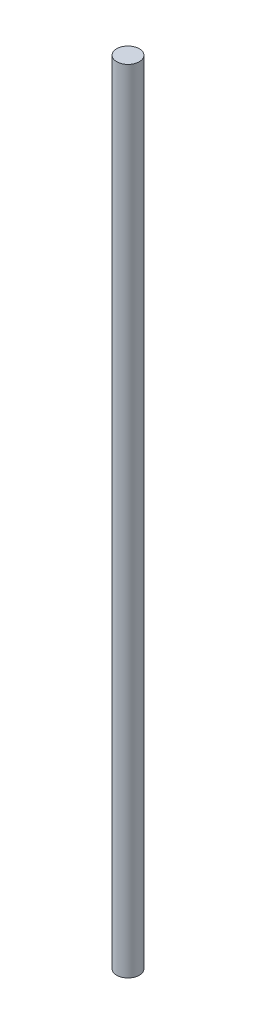
ISO-10303-21;
HEADER;
FILE_DESCRIPTION(('STEP AP214'),'2;1');
FILE_NAME('part.step','',(''),(''),'','','');
FILE_SCHEMA(('AUTOMOTIVE_DESIGN { 1 0 10303 214 1 1 1 1 }'));
ENDSEC;
DATA;
#1=APPLICATION_CONTEXT('core data for automotive mechanical design processes');
#2=APPLICATION_PROTOCOL_DEFINITION('international standard','automotive_design',2000,#1);
#3=PRODUCT_CONTEXT('',#1,'mechanical');
#4=PRODUCT('Part','Part','',(#3));
#5=PRODUCT_RELATED_PRODUCT_CATEGORY('part','',(#4));
#6=PRODUCT_DEFINITION_FORMATION('','',#4);
#7=PRODUCT_DEFINITION_CONTEXT('part definition',#1,'design');
#8=PRODUCT_DEFINITION('design','',#6,#7);
#9=PRODUCT_DEFINITION_SHAPE('','',#8);
#10=(LENGTH_UNIT() NAMED_UNIT(*) SI_UNIT(.MILLI.,.METRE.));
#11=(NAMED_UNIT(*) PLANE_ANGLE_UNIT() SI_UNIT($,.RADIAN.));
#12=(NAMED_UNIT(*) SI_UNIT($,.STERADIAN.) SOLID_ANGLE_UNIT());
#13=UNCERTAINTY_MEASURE_WITH_UNIT(LENGTH_MEASURE(1.E-05),#10,'distance_accuracy_value','');
#14=(GEOMETRIC_REPRESENTATION_CONTEXT(3) GLOBAL_UNCERTAINTY_ASSIGNED_CONTEXT((#13)) GLOBAL_UNIT_ASSIGNED_CONTEXT((#10,
#11,#12)) REPRESENTATION_CONTEXT('',''));
#15=CARTESIAN_POINT('',(0.,0.,0.));
#16=DIRECTION('',(0.,0.,1.));
#17=DIRECTION('',(1.,0.,0.));
#18=AXIS2_PLACEMENT_3D('',#15,#16,#17);
#19=CARTESIAN_POINT('',(0.,280.6,0.));
#20=DIRECTION('',(0.,-1.,0.));
#21=DIRECTION('',(0.,0.,-1.));
#22=AXIS2_PLACEMENT_3D('',#19,#20,#21);
#23=CYLINDRICAL_SURFACE('',#22,4.);
#24=CARTESIAN_POINT('',(0.,280.6,0.));
#25=DIRECTION('',(0.,1.,0.));
#26=DIRECTION('',(0.,0.,1.));
#27=AXIS2_PLACEMENT_3D('',#24,#25,#26);
#28=CIRCLE('',#27,4.);
#29=CARTESIAN_POINT('',(0.,280.6,4.));
#30=VERTEX_POINT('',#29);
#31=EDGE_CURVE('E10',#30,#30,#28,.T.);
#32=ORIENTED_EDGE('',*,*,#31,.F.);
#33=EDGE_LOOP('',(#32));
#34=FACE_BOUND('',#33,.T.);
#35=CARTESIAN_POINT('',(0.,0.,0.));
#36=DIRECTION('',(0.,1.,0.));
#37=DIRECTION('',(0.,0.,1.));
#38=AXIS2_PLACEMENT_3D('',#35,#36,#37);
#39=CIRCLE('',#38,4.);
#40=CARTESIAN_POINT('',(0.,0.,4.));
#41=VERTEX_POINT('',#40);
#42=EDGE_CURVE('E44',#41,#41,#39,.T.);
#43=ORIENTED_EDGE('',*,*,#42,.T.);
#44=EDGE_LOOP('',(#43));
#45=FACE_BOUND('',#44,.T.);
#46=ADVANCED_FACE('F41',(#34,#45),#23,.T.);
#47=CARTESIAN_POINT('',(0.,280.6,0.));
#48=DIRECTION('',(0.,1.,0.));
#49=DIRECTION('',(0.,0.,1.));
#50=AXIS2_PLACEMENT_3D('',#47,#48,#49);
#51=PLANE('',#50);
#52=ORIENTED_EDGE('',*,*,#31,.T.);
#53=EDGE_LOOP('',(#52));
#54=FACE_BOUND('',#53,.T.);
#55=ADVANCED_FACE('F58',(#54),#51,.T.);
#56=CARTESIAN_POINT('',(0.,0.,0.));
#57=DIRECTION('',(0.,1.,0.));
#58=DIRECTION('',(0.,0.,1.));
#59=AXIS2_PLACEMENT_3D('',#56,#57,#58);
#60=PLANE('',#59);
#61=ORIENTED_EDGE('',*,*,#42,.F.);
#62=EDGE_LOOP('',(#61));
#63=FACE_BOUND('',#62,.T.);
#64=ADVANCED_FACE('F56',(#63),#60,.F.);
#65=CLOSED_SHELL('',(#46,#55,#64));
#66=MANIFOLD_SOLID_BREP('B2',#65);
#67=ADVANCED_BREP_SHAPE_REPRESENTATION('',(#18,#66),#14);
#68=SHAPE_DEFINITION_REPRESENTATION(#9,#67);
ENDSEC;
END-ISO-10303-21;
